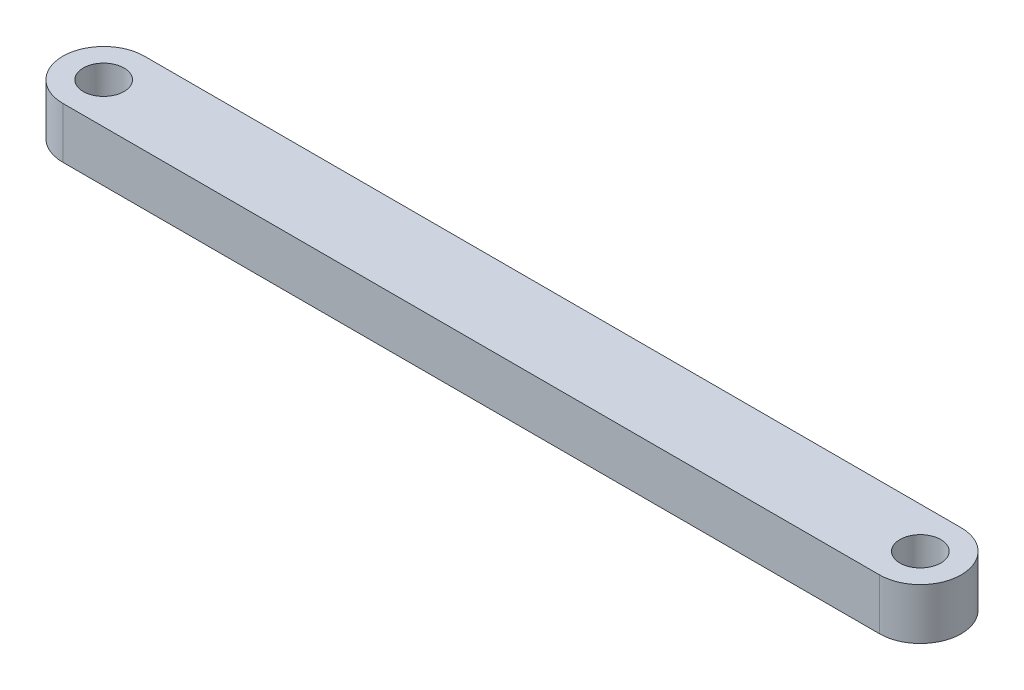
ISO-10303-21;
HEADER;
FILE_DESCRIPTION(('STEP AP214'),'2;1');
FILE_NAME('part.step','',(''),(''),'','','');
FILE_SCHEMA(('AUTOMOTIVE_DESIGN { 1 0 10303 214 1 1 1 1 }'));
ENDSEC;
DATA;
#1=APPLICATION_CONTEXT('core data for automotive mechanical design processes');
#2=APPLICATION_PROTOCOL_DEFINITION('international standard','automotive_design',2000,#1);
#3=PRODUCT_CONTEXT('',#1,'mechanical');
#4=PRODUCT('Part','Part','',(#3));
#5=PRODUCT_RELATED_PRODUCT_CATEGORY('part','',(#4));
#6=PRODUCT_DEFINITION_FORMATION('','',#4);
#7=PRODUCT_DEFINITION_CONTEXT('part definition',#1,'design');
#8=PRODUCT_DEFINITION('design','',#6,#7);
#9=PRODUCT_DEFINITION_SHAPE('','',#8);
#10=(LENGTH_UNIT() NAMED_UNIT(*) SI_UNIT(.MILLI.,.METRE.));
#11=(NAMED_UNIT(*) PLANE_ANGLE_UNIT() SI_UNIT($,.RADIAN.));
#12=(NAMED_UNIT(*) SI_UNIT($,.STERADIAN.) SOLID_ANGLE_UNIT());
#13=UNCERTAINTY_MEASURE_WITH_UNIT(LENGTH_MEASURE(1.E-05),#10,'distance_accuracy_value','');
#14=(GEOMETRIC_REPRESENTATION_CONTEXT(3) GLOBAL_UNCERTAINTY_ASSIGNED_CONTEXT((#13)) GLOBAL_UNIT_ASSIGNED_CONTEXT((#10,
#11,#12)) REPRESENTATION_CONTEXT('',''));
#15=CARTESIAN_POINT('',(0.,0.,0.));
#16=DIRECTION('',(0.,0.,1.));
#17=DIRECTION('',(1.,0.,0.));
#18=AXIS2_PLACEMENT_3D('',#15,#16,#17);
#19=CARTESIAN_POINT('',(-20.,2.5,0.));
#20=DIRECTION('',(0.,-1.,0.));
#21=DIRECTION('',(0.,0.,-1.));
#22=AXIS2_PLACEMENT_3D('',#19,#20,#21);
#23=CYLINDRICAL_SURFACE('',#22,2.);
#24=CARTESIAN_POINT('',(-20.,0.,0.));
#25=DIRECTION('',(0.,1.,0.));
#26=DIRECTION('',(0.,0.,1.));
#27=AXIS2_PLACEMENT_3D('',#24,#25,#26);
#28=CIRCLE('',#27,2.);
#29=CARTESIAN_POINT('',(-20.,0.,-2.));
#30=VERTEX_POINT('',#29);
#31=CARTESIAN_POINT('',(-20.,0.,2.));
#32=VERTEX_POINT('',#31);
#33=EDGE_CURVE('E98',#30,#32,#28,.T.);
#34=ORIENTED_EDGE('',*,*,#33,.T.);
#35=DIRECTION('',(0.,-1.,0.));
#36=VECTOR('',#35,1.);
#37=CARTESIAN_POINT('',(-20.,2.5,2.));
#38=LINE('',#37,#36);
#39=CARTESIAN_POINT('',(-20.,2.5,2.));
#40=VERTEX_POINT('',#39);
#41=EDGE_CURVE('E11',#40,#32,#38,.T.);
#42=ORIENTED_EDGE('',*,*,#41,.F.);
#43=CARTESIAN_POINT('',(-20.,2.5,0.));
#44=DIRECTION('',(0.,1.,0.));
#45=DIRECTION('',(0.,0.,1.));
#46=AXIS2_PLACEMENT_3D('',#43,#44,#45);
#47=CIRCLE('',#46,2.);
#48=CARTESIAN_POINT('',(-20.,2.5,-2.));
#49=VERTEX_POINT('',#48);
#50=EDGE_CURVE('E84',#49,#40,#47,.T.);
#51=ORIENTED_EDGE('',*,*,#50,.F.);
#52=DIRECTION('',(0.,-1.,0.));
#53=VECTOR('',#52,1.);
#54=CARTESIAN_POINT('',(-20.,2.5,-2.));
#55=LINE('',#54,#53);
#56=EDGE_CURVE('E51',#49,#30,#55,.T.);
#57=ORIENTED_EDGE('',*,*,#56,.T.);
#58=EDGE_LOOP('',(#34,#42,#51,#57));
#59=FACE_BOUND('',#58,.T.);
#60=ADVANCED_FACE('F35',(#59),#23,.T.);
#61=CARTESIAN_POINT('',(0.,2.5,2.));
#62=DIRECTION('',(0.,0.,-1.));
#63=DIRECTION('',(-1.,0.,0.));
#64=AXIS2_PLACEMENT_3D('',#61,#62,#63);
#65=PLANE('',#64);
#66=DIRECTION('',(1.,0.,0.));
#67=VECTOR('',#66,1.);
#68=CARTESIAN_POINT('',(0.,0.,2.));
#69=LINE('',#68,#67);
#70=CARTESIAN_POINT('',(20.,0.,2.));
#71=VERTEX_POINT('',#70);
#72=EDGE_CURVE('E89',#32,#71,#69,.T.);
#73=ORIENTED_EDGE('',*,*,#72,.T.);
#74=DIRECTION('',(0.,-1.,0.));
#75=VECTOR('',#74,1.);
#76=CARTESIAN_POINT('',(20.,2.5,2.));
#77=LINE('',#76,#75);
#78=CARTESIAN_POINT('',(20.,2.5,2.));
#79=VERTEX_POINT('',#78);
#80=EDGE_CURVE('E43',#79,#71,#77,.T.);
#81=ORIENTED_EDGE('',*,*,#80,.F.);
#82=DIRECTION('',(1.,0.,0.));
#83=VECTOR('',#82,1.);
#84=CARTESIAN_POINT('',(0.,2.5,2.));
#85=LINE('',#84,#83);
#86=EDGE_CURVE('E77',#40,#79,#85,.T.);
#87=ORIENTED_EDGE('',*,*,#86,.F.);
#88=ORIENTED_EDGE('',*,*,#41,.T.);
#89=EDGE_LOOP('',(#73,#81,#87,#88));
#90=FACE_BOUND('',#89,.T.);
#91=ADVANCED_FACE('F88',(#90),#65,.F.);
#92=CARTESIAN_POINT('',(20.,2.5,0.));
#93=DIRECTION('',(0.,-1.,0.));
#94=DIRECTION('',(0.,0.,-1.));
#95=AXIS2_PLACEMENT_3D('',#92,#93,#94);
#96=CYLINDRICAL_SURFACE('',#95,2.);
#97=CARTESIAN_POINT('',(20.,0.,0.));
#98=DIRECTION('',(0.,1.,0.));
#99=DIRECTION('',(0.,0.,1.));
#100=AXIS2_PLACEMENT_3D('',#97,#98,#99);
#101=CIRCLE('',#100,2.);
#102=CARTESIAN_POINT('',(20.,0.,-2.));
#103=VERTEX_POINT('',#102);
#104=EDGE_CURVE('E102',#71,#103,#101,.T.);
#105=ORIENTED_EDGE('',*,*,#104,.T.);
#106=DIRECTION('',(0.,-1.,0.));
#107=VECTOR('',#106,1.);
#108=CARTESIAN_POINT('',(20.,2.5,-2.));
#109=LINE('',#108,#107);
#110=CARTESIAN_POINT('',(20.,2.5,-2.));
#111=VERTEX_POINT('',#110);
#112=EDGE_CURVE('E66',#111,#103,#109,.T.);
#113=ORIENTED_EDGE('',*,*,#112,.F.);
#114=CARTESIAN_POINT('',(20.,2.5,0.));
#115=DIRECTION('',(0.,1.,0.));
#116=DIRECTION('',(0.,0.,1.));
#117=AXIS2_PLACEMENT_3D('',#114,#115,#116);
#118=CIRCLE('',#117,2.);
#119=EDGE_CURVE('E83',#79,#111,#118,.T.);
#120=ORIENTED_EDGE('',*,*,#119,.F.);
#121=ORIENTED_EDGE('',*,*,#80,.T.);
#122=EDGE_LOOP('',(#105,#113,#120,#121));
#123=FACE_BOUND('',#122,.T.);
#124=ADVANCED_FACE('F92',(#123),#96,.T.);
#125=CARTESIAN_POINT('',(0.,2.5,-2.));
#126=DIRECTION('',(0.,0.,-1.));
#127=DIRECTION('',(-1.,0.,0.));
#128=AXIS2_PLACEMENT_3D('',#125,#126,#127);
#129=PLANE('',#128);
#130=DIRECTION('',(1.,0.,0.));
#131=VECTOR('',#130,1.);
#132=CARTESIAN_POINT('',(0.,0.,-2.));
#133=LINE('',#132,#131);
#134=EDGE_CURVE('E104',#30,#103,#133,.T.);
#135=ORIENTED_EDGE('',*,*,#134,.F.);
#136=ORIENTED_EDGE('',*,*,#56,.F.);
#137=DIRECTION('',(1.,0.,0.));
#138=VECTOR('',#137,1.);
#139=CARTESIAN_POINT('',(0.,2.5,-2.));
#140=LINE('',#139,#138);
#141=EDGE_CURVE('E93',#49,#111,#140,.T.);
#142=ORIENTED_EDGE('',*,*,#141,.T.);
#143=ORIENTED_EDGE('',*,*,#112,.T.);
#144=EDGE_LOOP('',(#135,#136,#142,#143));
#145=FACE_BOUND('',#144,.T.);
#146=ADVANCED_FACE('F128',(#145),#129,.T.);
#147=CARTESIAN_POINT('',(0.,2.5,0.));
#148=DIRECTION('',(0.,1.,0.));
#149=DIRECTION('',(0.,0.,1.));
#150=AXIS2_PLACEMENT_3D('',#147,#148,#149);
#151=PLANE('',#150);
#152=CARTESIAN_POINT('',(20.,2.5,0.));
#153=DIRECTION('',(0.,1.,0.));
#154=DIRECTION('',(0.,0.,1.));
#155=AXIS2_PLACEMENT_3D('',#152,#153,#154);
#156=CIRCLE('',#155,0.999999999999998);
#157=CARTESIAN_POINT('',(20.,2.5,0.999999999999998));
#158=VERTEX_POINT('',#157);
#159=EDGE_CURVE('E100',#158,#158,#156,.T.);
#160=ORIENTED_EDGE('',*,*,#159,.F.);
#161=EDGE_LOOP('',(#160));
#162=FACE_BOUND('',#161,.T.);
#163=CARTESIAN_POINT('',(-20.,2.5,0.));
#164=DIRECTION('',(0.,1.,0.));
#165=DIRECTION('',(0.,0.,1.));
#166=AXIS2_PLACEMENT_3D('',#163,#164,#165);
#167=CIRCLE('',#166,0.999999999999998);
#168=CARTESIAN_POINT('',(-20.,2.5,0.999999999999998));
#169=VERTEX_POINT('',#168);
#170=EDGE_CURVE('E113',#169,#169,#167,.T.);
#171=ORIENTED_EDGE('',*,*,#170,.F.);
#172=EDGE_LOOP('',(#171));
#173=FACE_BOUND('',#172,.T.);
#174=ORIENTED_EDGE('',*,*,#50,.T.);
#175=ORIENTED_EDGE('',*,*,#86,.T.);
#176=ORIENTED_EDGE('',*,*,#119,.T.);
#177=ORIENTED_EDGE('',*,*,#141,.F.);
#178=EDGE_LOOP('',(#174,#175,#176,#177));
#179=FACE_BOUND('',#178,.T.);
#180=ADVANCED_FACE('F80',(#162,#173,#179),#151,.T.);
#181=CARTESIAN_POINT('',(0.,0.,0.));
#182=DIRECTION('',(0.,1.,0.));
#183=DIRECTION('',(0.,0.,1.));
#184=AXIS2_PLACEMENT_3D('',#181,#182,#183);
#185=PLANE('',#184);
#186=CARTESIAN_POINT('',(20.,0.,0.));
#187=DIRECTION('',(0.,1.,0.));
#188=DIRECTION('',(0.,0.,1.));
#189=AXIS2_PLACEMENT_3D('',#186,#187,#188);
#190=CIRCLE('',#189,0.999999999999998);
#191=CARTESIAN_POINT('',(20.,0.,0.999999999999998));
#192=VERTEX_POINT('',#191);
#193=EDGE_CURVE('E116',#192,#192,#190,.T.);
#194=ORIENTED_EDGE('',*,*,#193,.T.);
#195=EDGE_LOOP('',(#194));
#196=FACE_BOUND('',#195,.T.);
#197=CARTESIAN_POINT('',(-20.,0.,0.));
#198=DIRECTION('',(0.,1.,0.));
#199=DIRECTION('',(0.,0.,1.));
#200=AXIS2_PLACEMENT_3D('',#197,#198,#199);
#201=CIRCLE('',#200,0.999999999999998);
#202=CARTESIAN_POINT('',(-20.,0.,0.999999999999998));
#203=VERTEX_POINT('',#202);
#204=EDGE_CURVE('E110',#203,#203,#201,.T.);
#205=ORIENTED_EDGE('',*,*,#204,.T.);
#206=EDGE_LOOP('',(#205));
#207=FACE_BOUND('',#206,.T.);
#208=ORIENTED_EDGE('',*,*,#33,.F.);
#209=ORIENTED_EDGE('',*,*,#134,.T.);
#210=ORIENTED_EDGE('',*,*,#104,.F.);
#211=ORIENTED_EDGE('',*,*,#72,.F.);
#212=EDGE_LOOP('',(#208,#209,#210,#211));
#213=FACE_BOUND('',#212,.T.);
#214=ADVANCED_FACE('F127',(#196,#207,#213),#185,.F.);
#215=CARTESIAN_POINT('',(-20.,2.5,0.));
#216=DIRECTION('',(0.,-1.,0.));
#217=DIRECTION('',(0.,0.,-1.));
#218=AXIS2_PLACEMENT_3D('',#215,#216,#217);
#219=CYLINDRICAL_SURFACE('',#218,0.999999999999998);
#220=ORIENTED_EDGE('',*,*,#170,.T.);
#221=EDGE_LOOP('',(#220));
#222=FACE_BOUND('',#221,.T.);
#223=ORIENTED_EDGE('',*,*,#204,.F.);
#224=EDGE_LOOP('',(#223));
#225=FACE_BOUND('',#224,.T.);
#226=ADVANCED_FACE('F132',(#222,#225),#219,.F.);
#227=CARTESIAN_POINT('',(20.,2.5,0.));
#228=DIRECTION('',(0.,-1.,0.));
#229=DIRECTION('',(0.,0.,-1.));
#230=AXIS2_PLACEMENT_3D('',#227,#228,#229);
#231=CYLINDRICAL_SURFACE('',#230,0.999999999999998);
#232=ORIENTED_EDGE('',*,*,#159,.T.);
#233=EDGE_LOOP('',(#232));
#234=FACE_BOUND('',#233,.T.);
#235=ORIENTED_EDGE('',*,*,#193,.F.);
#236=EDGE_LOOP('',(#235));
#237=FACE_BOUND('',#236,.T.);
#238=ADVANCED_FACE('F122',(#234,#237),#231,.F.);
#239=CLOSED_SHELL('',(#60,#91,#124,#146,#180,#214,#226,#238));
#240=MANIFOLD_SOLID_BREP('B2',#239);
#241=ADVANCED_BREP_SHAPE_REPRESENTATION('',(#18,#240),#14);
#242=SHAPE_DEFINITION_REPRESENTATION(#9,#241);
ENDSEC;
END-ISO-10303-21;
